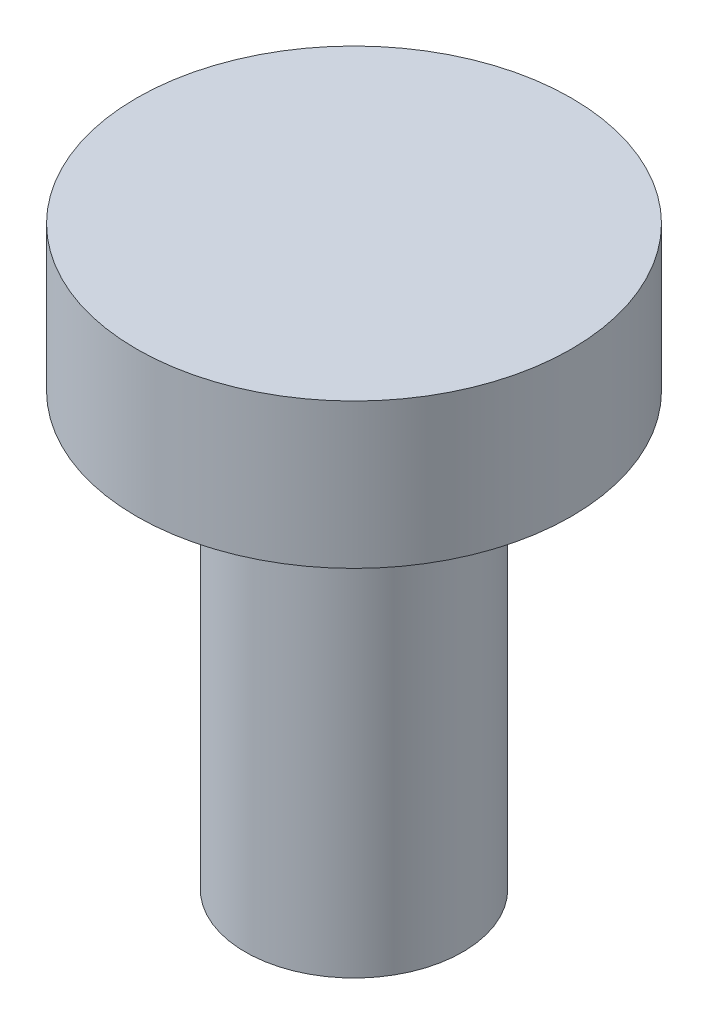
ISO-10303-21;
HEADER;
FILE_DESCRIPTION(('STEP AP214'),'2;1');
FILE_NAME('part.step','',(''),(''),'','','');
FILE_SCHEMA(('AUTOMOTIVE_DESIGN { 1 0 10303 214 1 1 1 1 }'));
ENDSEC;
DATA;
#1=APPLICATION_CONTEXT('core data for automotive mechanical design processes');
#2=APPLICATION_PROTOCOL_DEFINITION('international standard','automotive_design',2000,#1);
#3=PRODUCT_CONTEXT('',#1,'mechanical');
#4=PRODUCT('Part','Part','',(#3));
#5=PRODUCT_RELATED_PRODUCT_CATEGORY('part','',(#4));
#6=PRODUCT_DEFINITION_FORMATION('','',#4);
#7=PRODUCT_DEFINITION_CONTEXT('part definition',#1,'design');
#8=PRODUCT_DEFINITION('design','',#6,#7);
#9=PRODUCT_DEFINITION_SHAPE('','',#8);
#10=(LENGTH_UNIT() NAMED_UNIT(*) SI_UNIT(.MILLI.,.METRE.));
#11=(NAMED_UNIT(*) PLANE_ANGLE_UNIT() SI_UNIT($,.RADIAN.));
#12=(NAMED_UNIT(*) SI_UNIT($,.STERADIAN.) SOLID_ANGLE_UNIT());
#13=UNCERTAINTY_MEASURE_WITH_UNIT(LENGTH_MEASURE(1.E-05),#10,'distance_accuracy_value','');
#14=(GEOMETRIC_REPRESENTATION_CONTEXT(3) GLOBAL_UNCERTAINTY_ASSIGNED_CONTEXT((#13)) GLOBAL_UNIT_ASSIGNED_CONTEXT((#10,
#11,#12)) REPRESENTATION_CONTEXT('',''));
#15=CARTESIAN_POINT('',(0.,0.,0.));
#16=DIRECTION('',(0.,0.,1.));
#17=DIRECTION('',(1.,0.,0.));
#18=AXIS2_PLACEMENT_3D('',#15,#16,#17);
#19=CARTESIAN_POINT('',(0.,5.95551726147508,0.));
#20=DIRECTION('',(0.,-1.,0.));
#21=DIRECTION('',(0.,0.,-1.));
#22=AXIS2_PLACEMENT_3D('',#19,#20,#21);
#23=PLANE('',#22);
#24=CARTESIAN_POINT('',(0.,5.95551726147508,0.));
#25=DIRECTION('',(0.,-1.,0.));
#26=DIRECTION('',(0.,0.,-1.));
#27=AXIS2_PLACEMENT_3D('',#24,#25,#26);
#28=CIRCLE('',#27,3.);
#29=CARTESIAN_POINT('',(0.,5.95551726147508,-3.));
#30=VERTEX_POINT('',#29);
#31=EDGE_CURVE('E10',#30,#30,#28,.T.);
#32=ORIENTED_EDGE('',*,*,#31,.T.);
#33=EDGE_LOOP('',(#32));
#34=FACE_BOUND('',#33,.T.);
#35=CARTESIAN_POINT('',(0.,5.95551726147508,0.));
#36=DIRECTION('',(0.,-1.,0.));
#37=DIRECTION('',(0.,0.,-1.));
#38=AXIS2_PLACEMENT_3D('',#35,#36,#37);
#39=CIRCLE('',#38,1.5);
#40=CARTESIAN_POINT('',(0.,5.95551726147508,-1.5));
#41=VERTEX_POINT('',#40);
#42=EDGE_CURVE('E49',#41,#41,#39,.T.);
#43=ORIENTED_EDGE('',*,*,#42,.F.);
#44=EDGE_LOOP('',(#43));
#45=FACE_BOUND('',#44,.T.);
#46=ADVANCED_FACE('F35',(#34,#45),#23,.T.);
#47=CARTESIAN_POINT('',(0.,5.95551726147508,0.));
#48=DIRECTION('',(0.,-1.,0.));
#49=DIRECTION('',(0.,0.,-1.));
#50=AXIS2_PLACEMENT_3D('',#47,#48,#49);
#51=CYLINDRICAL_SURFACE('',#50,3.);
#52=CARTESIAN_POINT('',(0.,7.95551726147508,0.));
#53=DIRECTION('',(0.,-1.,0.));
#54=DIRECTION('',(0.,0.,-1.));
#55=AXIS2_PLACEMENT_3D('',#52,#53,#54);
#56=CIRCLE('',#55,3.);
#57=CARTESIAN_POINT('',(0.,7.95551726147508,-3.));
#58=VERTEX_POINT('',#57);
#59=EDGE_CURVE('E41',#58,#58,#56,.T.);
#60=ORIENTED_EDGE('',*,*,#59,.T.);
#61=EDGE_LOOP('',(#60));
#62=FACE_BOUND('',#61,.T.);
#63=ORIENTED_EDGE('',*,*,#31,.F.);
#64=EDGE_LOOP('',(#63));
#65=FACE_BOUND('',#64,.T.);
#66=ADVANCED_FACE('F59',(#62,#65),#51,.T.);
#67=CARTESIAN_POINT('',(0.,7.95551726147508,0.));
#68=DIRECTION('',(0.,-1.,0.));
#69=DIRECTION('',(0.,0.,-1.));
#70=AXIS2_PLACEMENT_3D('',#67,#68,#69);
#71=PLANE('',#70);
#72=ORIENTED_EDGE('',*,*,#59,.F.);
#73=EDGE_LOOP('',(#72));
#74=FACE_BOUND('',#73,.T.);
#75=ADVANCED_FACE('F63',(#74),#71,.F.);
#76=CARTESIAN_POINT('',(0.,0.,0.));
#77=DIRECTION('',(0.,-1.,0.));
#78=DIRECTION('',(0.,0.,-1.));
#79=AXIS2_PLACEMENT_3D('',#76,#77,#78);
#80=PLANE('',#79);
#81=CARTESIAN_POINT('',(0.,0.,0.));
#82=DIRECTION('',(0.,-1.,0.));
#83=DIRECTION('',(0.,0.,-1.));
#84=AXIS2_PLACEMENT_3D('',#81,#82,#83);
#85=CIRCLE('',#84,1.5);
#86=CARTESIAN_POINT('',(0.,0.,-1.5));
#87=VERTEX_POINT('',#86);
#88=EDGE_CURVE('E45',#87,#87,#85,.T.);
#89=ORIENTED_EDGE('',*,*,#88,.T.);
#90=EDGE_LOOP('',(#89));
#91=FACE_BOUND('',#90,.T.);
#92=ADVANCED_FACE('F67',(#91),#80,.T.);
#93=CARTESIAN_POINT('',(0.,5.95551726147508,0.));
#94=DIRECTION('',(0.,-1.,0.));
#95=DIRECTION('',(0.,0.,-1.));
#96=AXIS2_PLACEMENT_3D('',#93,#94,#95);
#97=CYLINDRICAL_SURFACE('',#96,1.5);
#98=ORIENTED_EDGE('',*,*,#42,.T.);
#99=EDGE_LOOP('',(#98));
#100=FACE_BOUND('',#99,.T.);
#101=ORIENTED_EDGE('',*,*,#88,.F.);
#102=EDGE_LOOP('',(#101));
#103=FACE_BOUND('',#102,.T.);
#104=ADVANCED_FACE('F55',(#100,#103),#97,.T.);
#105=CLOSED_SHELL('',(#46,#66,#75,#92,#104));
#106=MANIFOLD_SOLID_BREP('B2',#105);
#107=ADVANCED_BREP_SHAPE_REPRESENTATION('',(#18,#106),#14);
#108=SHAPE_DEFINITION_REPRESENTATION(#9,#107);
ENDSEC;
END-ISO-10303-21;
